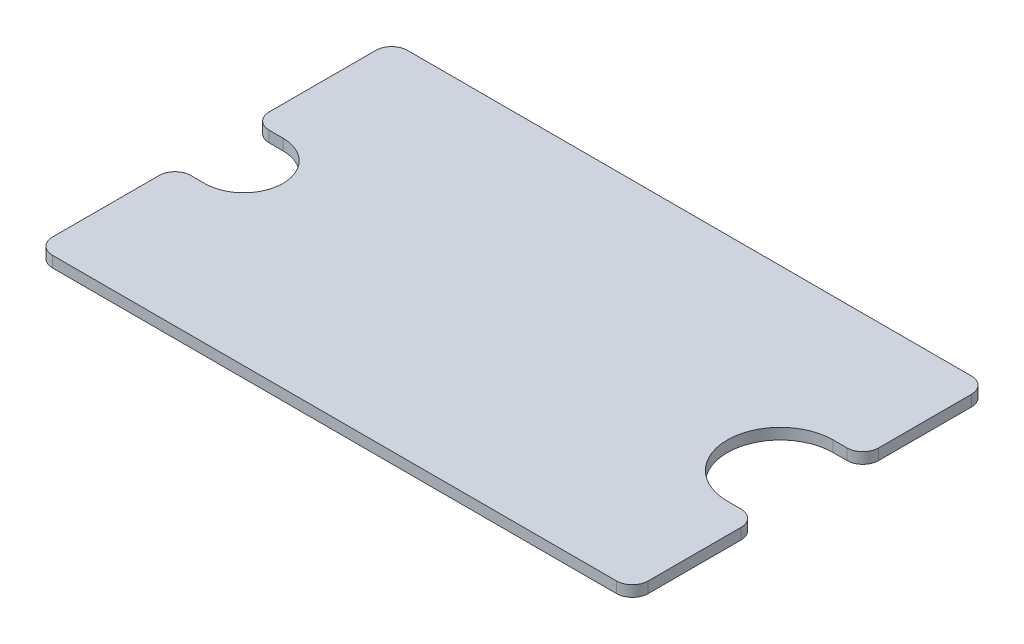
ISO-10303-21;
HEADER;
FILE_DESCRIPTION(('STEP AP214'),'2;1');
FILE_NAME('part.step','',(''),(''),'','','');
FILE_SCHEMA(('AUTOMOTIVE_DESIGN { 1 0 10303 214 1 1 1 1 }'));
ENDSEC;
DATA;
#1=APPLICATION_CONTEXT('core data for automotive mechanical design processes');
#2=APPLICATION_PROTOCOL_DEFINITION('international standard','automotive_design',2000,#1);
#3=PRODUCT_CONTEXT('',#1,'mechanical');
#4=PRODUCT('Part','Part','',(#3));
#5=PRODUCT_RELATED_PRODUCT_CATEGORY('part','',(#4));
#6=PRODUCT_DEFINITION_FORMATION('','',#4);
#7=PRODUCT_DEFINITION_CONTEXT('part definition',#1,'design');
#8=PRODUCT_DEFINITION('design','',#6,#7);
#9=PRODUCT_DEFINITION_SHAPE('','',#8);
#10=(LENGTH_UNIT() NAMED_UNIT(*) SI_UNIT(.MILLI.,.METRE.));
#11=(NAMED_UNIT(*) PLANE_ANGLE_UNIT() SI_UNIT($,.RADIAN.));
#12=(NAMED_UNIT(*) SI_UNIT($,.STERADIAN.) SOLID_ANGLE_UNIT());
#13=UNCERTAINTY_MEASURE_WITH_UNIT(LENGTH_MEASURE(1.E-05),#10,'distance_accuracy_value','');
#14=(GEOMETRIC_REPRESENTATION_CONTEXT(3) GLOBAL_UNCERTAINTY_ASSIGNED_CONTEXT((#13)) GLOBAL_UNIT_ASSIGNED_CONTEXT((#10,
#11,#12)) REPRESENTATION_CONTEXT('',''));
#15=CARTESIAN_POINT('',(0.,0.,0.));
#16=DIRECTION('',(0.,0.,1.));
#17=DIRECTION('',(1.,0.,0.));
#18=AXIS2_PLACEMENT_3D('',#15,#16,#17);
#19=CARTESIAN_POINT('',(6.49999999999997,7.6,-6.5));
#20=DIRECTION('',(0.,1.,0.));
#21=DIRECTION('',(0.,0.,1.));
#22=AXIS2_PLACEMENT_3D('',#19,#20,#21);
#23=PLANE('',#22);
#24=CARTESIAN_POINT('',(6.49999999999997,7.6,-6.5));
#25=DIRECTION('',(0.,1.,0.));
#26=DIRECTION('',(0.,0.,1.));
#27=AXIS2_PLACEMENT_3D('',#24,#25,#26);
#28=CIRCLE('',#27,2.3);
#29=CARTESIAN_POINT('',(4.19999999999997,7.6,-6.5));
#30=VERTEX_POINT('',#29);
#31=CARTESIAN_POINT('',(6.49999999999997,7.6,-4.2));
#32=VERTEX_POINT('',#31);
#33=EDGE_CURVE('E175',#30,#32,#28,.T.);
#34=ORIENTED_EDGE('',*,*,#33,.T.);
#35=DIRECTION('',(1.,0.,0.));
#36=VECTOR('',#35,1.);
#37=CARTESIAN_POINT('',(6.49999999999997,7.6,-4.2));
#38=LINE('',#37,#36);
#39=CARTESIAN_POINT('',(88.5,7.6,-4.2));
#40=VERTEX_POINT('',#39);
#41=EDGE_CURVE('E249',#32,#40,#38,.T.);
#42=ORIENTED_EDGE('',*,*,#41,.T.);
#43=CARTESIAN_POINT('',(88.5,7.6,-6.5));
#44=DIRECTION('',(0.,1.,0.));
#45=DIRECTION('',(0.,0.,1.));
#46=AXIS2_PLACEMENT_3D('',#43,#44,#45);
#47=CIRCLE('',#46,2.3);
#48=CARTESIAN_POINT('',(90.8,7.6,-6.5));
#49=VERTEX_POINT('',#48);
#50=EDGE_CURVE('E245',#40,#49,#47,.T.);
#51=ORIENTED_EDGE('',*,*,#50,.T.);
#52=DIRECTION('',(0.,0.,-1.));
#53=VECTOR('',#52,1.);
#54=CARTESIAN_POINT('',(90.8,7.6,-6.5));
#55=LINE('',#54,#53);
#56=CARTESIAN_POINT('',(90.8,7.6,-20.));
#57=VERTEX_POINT('',#56);
#58=EDGE_CURVE('E371',#49,#57,#55,.T.);
#59=ORIENTED_EDGE('',*,*,#58,.T.);
#60=CARTESIAN_POINT('',(88.5,7.6,-20.));
#61=DIRECTION('',(0.,1.,0.));
#62=DIRECTION('',(0.,0.,1.));
#63=AXIS2_PLACEMENT_3D('',#60,#61,#62);
#64=CIRCLE('',#63,2.3);
#65=CARTESIAN_POINT('',(88.5,7.6,-22.3));
#66=VERTEX_POINT('',#65);
#67=EDGE_CURVE('E367',#57,#66,#64,.T.);
#68=ORIENTED_EDGE('',*,*,#67,.T.);
#69=DIRECTION('',(-1.,0.,0.));
#70=VECTOR('',#69,1.);
#71=CARTESIAN_POINT('',(88.5,7.6,-22.3));
#72=LINE('',#71,#70);
#73=CARTESIAN_POINT('',(86.5,7.6,-22.3));
#74=VERTEX_POINT('',#73);
#75=EDGE_CURVE('E361',#66,#74,#72,.T.);
#76=ORIENTED_EDGE('',*,*,#75,.T.);
#77=CARTESIAN_POINT('',(86.5,7.6,-30.));
#78=DIRECTION('',(0.,-1.,0.));
#79=DIRECTION('',(0.,0.,1.));
#80=AXIS2_PLACEMENT_3D('',#77,#78,#79);
#81=CIRCLE('',#80,7.70000000000001);
#82=CARTESIAN_POINT('',(86.5,7.6,-37.7));
#83=VERTEX_POINT('',#82);
#84=EDGE_CURVE('E357',#74,#83,#81,.T.);
#85=ORIENTED_EDGE('',*,*,#84,.T.);
#86=DIRECTION('',(1.,0.,0.));
#87=VECTOR('',#86,1.);
#88=CARTESIAN_POINT('',(86.5,7.6,-37.7));
#89=LINE('',#88,#87);
#90=CARTESIAN_POINT('',(88.5,7.6,-37.7));
#91=VERTEX_POINT('',#90);
#92=EDGE_CURVE('E351',#83,#91,#89,.T.);
#93=ORIENTED_EDGE('',*,*,#92,.T.);
#94=CARTESIAN_POINT('',(88.5,7.6,-40.));
#95=DIRECTION('',(0.,1.,0.));
#96=DIRECTION('',(0.,0.,1.));
#97=AXIS2_PLACEMENT_3D('',#94,#95,#96);
#98=CIRCLE('',#97,2.3);
#99=CARTESIAN_POINT('',(90.8,7.6,-40.));
#100=VERTEX_POINT('',#99);
#101=EDGE_CURVE('E347',#91,#100,#98,.T.);
#102=ORIENTED_EDGE('',*,*,#101,.T.);
#103=DIRECTION('',(0.,0.,-1.));
#104=VECTOR('',#103,1.);
#105=CARTESIAN_POINT('',(90.8,7.6,-40.));
#106=LINE('',#105,#104);
#107=CARTESIAN_POINT('',(90.8,7.6,-53.5));
#108=VERTEX_POINT('',#107);
#109=EDGE_CURVE('E341',#100,#108,#106,.T.);
#110=ORIENTED_EDGE('',*,*,#109,.T.);
#111=CARTESIAN_POINT('',(88.5,7.6,-53.5));
#112=DIRECTION('',(0.,1.,0.));
#113=DIRECTION('',(0.,0.,1.));
#114=AXIS2_PLACEMENT_3D('',#111,#112,#113);
#115=CIRCLE('',#114,2.3);
#116=CARTESIAN_POINT('',(88.5,7.6,-55.8));
#117=VERTEX_POINT('',#116);
#118=EDGE_CURVE('E337',#108,#117,#115,.T.);
#119=ORIENTED_EDGE('',*,*,#118,.T.);
#120=DIRECTION('',(-1.,0.,0.));
#121=VECTOR('',#120,1.);
#122=CARTESIAN_POINT('',(88.5,7.6,-55.8));
#123=LINE('',#122,#121);
#124=CARTESIAN_POINT('',(6.50000000000001,7.6,-55.8));
#125=VERTEX_POINT('',#124);
#126=EDGE_CURVE('E331',#117,#125,#123,.T.);
#127=ORIENTED_EDGE('',*,*,#126,.T.);
#128=CARTESIAN_POINT('',(6.49999999999998,7.6,-53.5));
#129=DIRECTION('',(0.,1.,0.));
#130=DIRECTION('',(0.,0.,1.));
#131=AXIS2_PLACEMENT_3D('',#128,#129,#130);
#132=CIRCLE('',#131,2.3);
#133=CARTESIAN_POINT('',(4.19999999999998,7.6,-53.5));
#134=VERTEX_POINT('',#133);
#135=EDGE_CURVE('E327',#125,#134,#132,.T.);
#136=ORIENTED_EDGE('',*,*,#135,.T.);
#137=DIRECTION('',(0.,0.,1.));
#138=VECTOR('',#137,1.);
#139=CARTESIAN_POINT('',(4.19999999999998,7.6,-53.5));
#140=LINE('',#139,#138);
#141=CARTESIAN_POINT('',(4.19999999999997,7.6,-38.));
#142=VERTEX_POINT('',#141);
#143=EDGE_CURVE('E321',#134,#142,#140,.T.);
#144=ORIENTED_EDGE('',*,*,#143,.T.);
#145=CARTESIAN_POINT('',(6.49999999999997,7.6,-38.));
#146=DIRECTION('',(0.,1.,0.));
#147=DIRECTION('',(0.,0.,1.));
#148=AXIS2_PLACEMENT_3D('',#145,#146,#147);
#149=CIRCLE('',#148,2.3);
#150=CARTESIAN_POINT('',(6.49999999999997,7.6,-35.7));
#151=VERTEX_POINT('',#150);
#152=EDGE_CURVE('E317',#142,#151,#149,.T.);
#153=ORIENTED_EDGE('',*,*,#152,.T.);
#154=DIRECTION('',(1.,0.,0.));
#155=VECTOR('',#154,1.);
#156=CARTESIAN_POINT('',(6.49999999999997,7.6,-35.7));
#157=LINE('',#156,#155);
#158=CARTESIAN_POINT('',(8.5,7.6,-35.7));
#159=VERTEX_POINT('',#158);
#160=EDGE_CURVE('E311',#151,#159,#157,.T.);
#161=ORIENTED_EDGE('',*,*,#160,.T.);
#162=CARTESIAN_POINT('',(8.5,7.6,-30.));
#163=DIRECTION('',(0.,-1.,0.));
#164=DIRECTION('',(0.,0.,1.));
#165=AXIS2_PLACEMENT_3D('',#162,#163,#164);
#166=CIRCLE('',#165,5.7);
#167=CARTESIAN_POINT('',(8.5,7.6,-24.3));
#168=VERTEX_POINT('',#167);
#169=EDGE_CURVE('E307',#159,#168,#166,.T.);
#170=ORIENTED_EDGE('',*,*,#169,.T.);
#171=DIRECTION('',(-1.,0.,0.));
#172=VECTOR('',#171,1.);
#173=CARTESIAN_POINT('',(8.5,7.6,-24.3));
#174=LINE('',#173,#172);
#175=CARTESIAN_POINT('',(6.49999999999997,7.6,-24.3));
#176=VERTEX_POINT('',#175);
#177=EDGE_CURVE('E389',#168,#176,#174,.T.);
#178=ORIENTED_EDGE('',*,*,#177,.T.);
#179=CARTESIAN_POINT('',(6.49999999999997,7.6,-22.));
#180=DIRECTION('',(0.,1.,0.));
#181=DIRECTION('',(0.,0.,1.));
#182=AXIS2_PLACEMENT_3D('',#179,#180,#181);
#183=CIRCLE('',#182,2.3);
#184=CARTESIAN_POINT('',(4.19999999999997,7.6,-22.));
#185=VERTEX_POINT('',#184);
#186=EDGE_CURVE('E391',#176,#185,#183,.T.);
#187=ORIENTED_EDGE('',*,*,#186,.T.);
#188=DIRECTION('',(0.,0.,1.));
#189=VECTOR('',#188,1.);
#190=CARTESIAN_POINT('',(4.19999999999997,7.6,-22.));
#191=LINE('',#190,#189);
#192=EDGE_CURVE('E48',#185,#30,#191,.T.);
#193=ORIENTED_EDGE('',*,*,#192,.T.);
#194=EDGE_LOOP('',(#34,#42,#51,#59,#68,#76,#85,#93,#102,#110,#119,#127,#136,#144,#153,#161,#170,
#178,#187,#193));
#195=FACE_BOUND('',#194,.T.);
#196=ADVANCED_FACE('F32',(#195),#23,.T.);
#197=CARTESIAN_POINT('',(4.19999999999997,7.6,-22.));
#198=DIRECTION('',(1.,0.,0.));
#199=DIRECTION('',(0.,0.,-1.));
#200=AXIS2_PLACEMENT_3D('',#197,#198,#199);
#201=PLANE('',#200);
#202=DIRECTION('',(0.,0.,1.));
#203=VECTOR('',#202,1.);
#204=CARTESIAN_POINT('',(4.19999999999997,6.,-22.));
#205=LINE('',#204,#203);
#206=CARTESIAN_POINT('',(4.19999999999997,6.,-22.));
#207=VERTEX_POINT('',#206);
#208=CARTESIAN_POINT('',(4.19999999999997,6.,-6.5));
#209=VERTEX_POINT('',#208);
#210=EDGE_CURVE('E165',#207,#209,#205,.T.);
#211=ORIENTED_EDGE('',*,*,#210,.T.);
#212=DIRECTION('',(0.,-1.,0.));
#213=VECTOR('',#212,1.);
#214=CARTESIAN_POINT('',(4.19999999999997,7.6,-6.5));
#215=LINE('',#214,#213);
#216=EDGE_CURVE('E188',#30,#209,#215,.T.);
#217=ORIENTED_EDGE('',*,*,#216,.F.);
#218=ORIENTED_EDGE('',*,*,#192,.F.);
#219=DIRECTION('',(0.,-1.,0.));
#220=VECTOR('',#219,1.);
#221=CARTESIAN_POINT('',(4.19999999999997,7.6,-22.));
#222=LINE('',#221,#220);
#223=EDGE_CURVE('E182',#185,#207,#222,.T.);
#224=ORIENTED_EDGE('',*,*,#223,.T.);
#225=EDGE_LOOP('',(#211,#217,#218,#224));
#226=FACE_BOUND('',#225,.T.);
#227=ADVANCED_FACE('F187',(#226),#201,.F.);
#228=CARTESIAN_POINT('',(6.49999999999997,7.6,-22.));
#229=DIRECTION('',(0.,-1.,0.));
#230=DIRECTION('',(0.,0.,-1.));
#231=AXIS2_PLACEMENT_3D('',#228,#229,#230);
#232=CYLINDRICAL_SURFACE('',#231,2.3);
#233=CARTESIAN_POINT('',(6.49999999999997,6.,-22.));
#234=DIRECTION('',(0.,1.,0.));
#235=DIRECTION('',(0.,0.,1.));
#236=AXIS2_PLACEMENT_3D('',#233,#234,#235);
#237=CIRCLE('',#236,2.3);
#238=CARTESIAN_POINT('',(6.49999999999997,6.,-24.3));
#239=VERTEX_POINT('',#238);
#240=EDGE_CURVE('E168',#239,#207,#237,.T.);
#241=ORIENTED_EDGE('',*,*,#240,.T.);
#242=ORIENTED_EDGE('',*,*,#223,.F.);
#243=ORIENTED_EDGE('',*,*,#186,.F.);
#244=DIRECTION('',(0.,-1.,0.));
#245=VECTOR('',#244,1.);
#246=CARTESIAN_POINT('',(6.49999999999997,7.6,-24.3));
#247=LINE('',#246,#245);
#248=EDGE_CURVE('E184',#176,#239,#247,.T.);
#249=ORIENTED_EDGE('',*,*,#248,.T.);
#250=EDGE_LOOP('',(#241,#242,#243,#249));
#251=FACE_BOUND('',#250,.T.);
#252=ADVANCED_FACE('F180',(#251),#232,.T.);
#253=CARTESIAN_POINT('',(8.5,7.6,-24.3));
#254=DIRECTION('',(0.,0.,1.));
#255=DIRECTION('',(1.,0.,0.));
#256=AXIS2_PLACEMENT_3D('',#253,#254,#255);
#257=PLANE('',#256);
#258=DIRECTION('',(-1.,0.,0.));
#259=VECTOR('',#258,1.);
#260=CARTESIAN_POINT('',(8.5,6.,-24.3));
#261=LINE('',#260,#259);
#262=CARTESIAN_POINT('',(8.5,6.,-24.3));
#263=VERTEX_POINT('',#262);
#264=EDGE_CURVE('E185',#263,#239,#261,.T.);
#265=ORIENTED_EDGE('',*,*,#264,.T.);
#266=ORIENTED_EDGE('',*,*,#248,.F.);
#267=ORIENTED_EDGE('',*,*,#177,.F.);
#268=DIRECTION('',(0.,-1.,0.));
#269=VECTOR('',#268,1.);
#270=CARTESIAN_POINT('',(8.5,7.6,-24.3));
#271=LINE('',#270,#269);
#272=EDGE_CURVE('E190',#168,#263,#271,.T.);
#273=ORIENTED_EDGE('',*,*,#272,.T.);
#274=EDGE_LOOP('',(#265,#266,#267,#273));
#275=FACE_BOUND('',#274,.T.);
#276=ADVANCED_FACE('F300',(#275),#257,.F.);
#277=CARTESIAN_POINT('',(8.5,7.6,-30.));
#278=DIRECTION('',(0.,-1.,0.));
#279=DIRECTION('',(0.,0.,-1.));
#280=AXIS2_PLACEMENT_3D('',#277,#278,#279);
#281=CYLINDRICAL_SURFACE('',#280,5.7);
#282=CARTESIAN_POINT('',(8.5,6.,-30.));
#283=DIRECTION('',(0.,-1.,0.));
#284=DIRECTION('',(0.,0.,1.));
#285=AXIS2_PLACEMENT_3D('',#282,#283,#284);
#286=CIRCLE('',#285,5.7);
#287=CARTESIAN_POINT('',(8.5,6.,-35.7));
#288=VERTEX_POINT('',#287);
#289=EDGE_CURVE('E296',#288,#263,#286,.T.);
#290=ORIENTED_EDGE('',*,*,#289,.T.);
#291=ORIENTED_EDGE('',*,*,#272,.F.);
#292=ORIENTED_EDGE('',*,*,#169,.F.);
#293=DIRECTION('',(0.,-1.,0.));
#294=VECTOR('',#293,1.);
#295=CARTESIAN_POINT('',(8.5,7.6,-35.7));
#296=LINE('',#295,#294);
#297=EDGE_CURVE('E196',#159,#288,#296,.T.);
#298=ORIENTED_EDGE('',*,*,#297,.T.);
#299=EDGE_LOOP('',(#290,#291,#292,#298));
#300=FACE_BOUND('',#299,.T.);
#301=ADVANCED_FACE('F304',(#300),#281,.F.);
#302=CARTESIAN_POINT('',(6.49999999999997,7.6,-35.7));
#303=DIRECTION('',(0.,0.,-1.));
#304=DIRECTION('',(-1.,0.,0.));
#305=AXIS2_PLACEMENT_3D('',#302,#303,#304);
#306=PLANE('',#305);
#307=DIRECTION('',(1.,0.,0.));
#308=VECTOR('',#307,1.);
#309=CARTESIAN_POINT('',(6.49999999999997,6.,-35.7));
#310=LINE('',#309,#308);
#311=CARTESIAN_POINT('',(6.49999999999997,6.,-35.7));
#312=VERTEX_POINT('',#311);
#313=EDGE_CURVE('E293',#312,#288,#310,.T.);
#314=ORIENTED_EDGE('',*,*,#313,.T.);
#315=ORIENTED_EDGE('',*,*,#297,.F.);
#316=ORIENTED_EDGE('',*,*,#160,.F.);
#317=DIRECTION('',(0.,-1.,0.));
#318=VECTOR('',#317,1.);
#319=CARTESIAN_POINT('',(6.49999999999997,7.6,-35.7));
#320=LINE('',#319,#318);
#321=EDGE_CURVE('E199',#151,#312,#320,.T.);
#322=ORIENTED_EDGE('',*,*,#321,.T.);
#323=EDGE_LOOP('',(#314,#315,#316,#322));
#324=FACE_BOUND('',#323,.T.);
#325=ADVANCED_FACE('F310',(#324),#306,.F.);
#326=CARTESIAN_POINT('',(6.49999999999997,7.6,-38.));
#327=DIRECTION('',(0.,-1.,0.));
#328=DIRECTION('',(0.,0.,-1.));
#329=AXIS2_PLACEMENT_3D('',#326,#327,#328);
#330=CYLINDRICAL_SURFACE('',#329,2.3);
#331=CARTESIAN_POINT('',(6.49999999999997,6.,-38.));
#332=DIRECTION('',(0.,1.,0.));
#333=DIRECTION('',(0.,0.,1.));
#334=AXIS2_PLACEMENT_3D('',#331,#332,#333);
#335=CIRCLE('',#334,2.3);
#336=CARTESIAN_POINT('',(4.19999999999997,6.,-38.));
#337=VERTEX_POINT('',#336);
#338=EDGE_CURVE('E290',#337,#312,#335,.T.);
#339=ORIENTED_EDGE('',*,*,#338,.T.);
#340=ORIENTED_EDGE('',*,*,#321,.F.);
#341=ORIENTED_EDGE('',*,*,#152,.F.);
#342=DIRECTION('',(0.,-1.,0.));
#343=VECTOR('',#342,1.);
#344=CARTESIAN_POINT('',(4.19999999999997,7.6,-38.));
#345=LINE('',#344,#343);
#346=EDGE_CURVE('E202',#142,#337,#345,.T.);
#347=ORIENTED_EDGE('',*,*,#346,.T.);
#348=EDGE_LOOP('',(#339,#340,#341,#347));
#349=FACE_BOUND('',#348,.T.);
#350=ADVANCED_FACE('F314',(#349),#330,.T.);
#351=CARTESIAN_POINT('',(4.19999999999998,7.6,-53.5));
#352=DIRECTION('',(1.,0.,0.));
#353=DIRECTION('',(0.,0.,-1.));
#354=AXIS2_PLACEMENT_3D('',#351,#352,#353);
#355=PLANE('',#354);
#356=DIRECTION('',(0.,0.,1.));
#357=VECTOR('',#356,1.);
#358=CARTESIAN_POINT('',(4.19999999999998,6.,-53.5));
#359=LINE('',#358,#357);
#360=CARTESIAN_POINT('',(4.19999999999998,6.,-53.5));
#361=VERTEX_POINT('',#360);
#362=EDGE_CURVE('E287',#361,#337,#359,.T.);
#363=ORIENTED_EDGE('',*,*,#362,.T.);
#364=ORIENTED_EDGE('',*,*,#346,.F.);
#365=ORIENTED_EDGE('',*,*,#143,.F.);
#366=DIRECTION('',(0.,-1.,0.));
#367=VECTOR('',#366,1.);
#368=CARTESIAN_POINT('',(4.19999999999998,7.6,-53.5));
#369=LINE('',#368,#367);
#370=EDGE_CURVE('E205',#134,#361,#369,.T.);
#371=ORIENTED_EDGE('',*,*,#370,.T.);
#372=EDGE_LOOP('',(#363,#364,#365,#371));
#373=FACE_BOUND('',#372,.T.);
#374=ADVANCED_FACE('F320',(#373),#355,.F.);
#375=CARTESIAN_POINT('',(6.49999999999998,7.6,-53.5));
#376=DIRECTION('',(0.,-1.,0.));
#377=DIRECTION('',(0.,0.,-1.));
#378=AXIS2_PLACEMENT_3D('',#375,#376,#377);
#379=CYLINDRICAL_SURFACE('',#378,2.3);
#380=CARTESIAN_POINT('',(6.49999999999998,6.,-53.5));
#381=DIRECTION('',(0.,1.,0.));
#382=DIRECTION('',(0.,0.,1.));
#383=AXIS2_PLACEMENT_3D('',#380,#381,#382);
#384=CIRCLE('',#383,2.3);
#385=CARTESIAN_POINT('',(6.49999999999998,6.,-55.8));
#386=VERTEX_POINT('',#385);
#387=EDGE_CURVE('E284',#386,#361,#384,.T.);
#388=ORIENTED_EDGE('',*,*,#387,.T.);
#389=ORIENTED_EDGE('',*,*,#370,.F.);
#390=ORIENTED_EDGE('',*,*,#135,.F.);
#391=DIRECTION('',(0.,-1.,0.));
#392=VECTOR('',#391,1.);
#393=CARTESIAN_POINT('',(6.50000000000001,7.6,-55.8));
#394=LINE('',#393,#392);
#395=EDGE_CURVE('E208',#125,#386,#394,.T.);
#396=ORIENTED_EDGE('',*,*,#395,.T.);
#397=EDGE_LOOP('',(#388,#389,#390,#396));
#398=FACE_BOUND('',#397,.T.);
#399=ADVANCED_FACE('F324',(#398),#379,.T.);
#400=CARTESIAN_POINT('',(88.5,7.6,-55.8));
#401=DIRECTION('',(0.,0.,1.));
#402=DIRECTION('',(1.,0.,0.));
#403=AXIS2_PLACEMENT_3D('',#400,#401,#402);
#404=PLANE('',#403);
#405=DIRECTION('',(-1.,0.,0.));
#406=VECTOR('',#405,1.);
#407=CARTESIAN_POINT('',(88.5,6.,-55.8));
#408=LINE('',#407,#406);
#409=CARTESIAN_POINT('',(88.5,6.,-55.8));
#410=VERTEX_POINT('',#409);
#411=EDGE_CURVE('E281',#410,#386,#408,.T.);
#412=ORIENTED_EDGE('',*,*,#411,.T.);
#413=ORIENTED_EDGE('',*,*,#395,.F.);
#414=ORIENTED_EDGE('',*,*,#126,.F.);
#415=DIRECTION('',(0.,-1.,0.));
#416=VECTOR('',#415,1.);
#417=CARTESIAN_POINT('',(88.5,7.6,-55.8));
#418=LINE('',#417,#416);
#419=EDGE_CURVE('E211',#117,#410,#418,.T.);
#420=ORIENTED_EDGE('',*,*,#419,.T.);
#421=EDGE_LOOP('',(#412,#413,#414,#420));
#422=FACE_BOUND('',#421,.T.);
#423=ADVANCED_FACE('F330',(#422),#404,.F.);
#424=CARTESIAN_POINT('',(88.5,7.6,-53.5));
#425=DIRECTION('',(0.,-1.,0.));
#426=DIRECTION('',(0.,0.,-1.));
#427=AXIS2_PLACEMENT_3D('',#424,#425,#426);
#428=CYLINDRICAL_SURFACE('',#427,2.3);
#429=CARTESIAN_POINT('',(88.5,6.,-53.5));
#430=DIRECTION('',(0.,1.,0.));
#431=DIRECTION('',(0.,0.,1.));
#432=AXIS2_PLACEMENT_3D('',#429,#430,#431);
#433=CIRCLE('',#432,2.3);
#434=CARTESIAN_POINT('',(90.8,6.,-53.5));
#435=VERTEX_POINT('',#434);
#436=EDGE_CURVE('E278',#435,#410,#433,.T.);
#437=ORIENTED_EDGE('',*,*,#436,.T.);
#438=ORIENTED_EDGE('',*,*,#419,.F.);
#439=ORIENTED_EDGE('',*,*,#118,.F.);
#440=DIRECTION('',(0.,-1.,0.));
#441=VECTOR('',#440,1.);
#442=CARTESIAN_POINT('',(90.8,7.6,-53.5));
#443=LINE('',#442,#441);
#444=EDGE_CURVE('E214',#108,#435,#443,.T.);
#445=ORIENTED_EDGE('',*,*,#444,.T.);
#446=EDGE_LOOP('',(#437,#438,#439,#445));
#447=FACE_BOUND('',#446,.T.);
#448=ADVANCED_FACE('F334',(#447),#428,.T.);
#449=CARTESIAN_POINT('',(90.8,7.6,-40.));
#450=DIRECTION('',(-1.,0.,0.));
#451=DIRECTION('',(0.,0.,1.));
#452=AXIS2_PLACEMENT_3D('',#449,#450,#451);
#453=PLANE('',#452);
#454=DIRECTION('',(0.,0.,-1.));
#455=VECTOR('',#454,1.);
#456=CARTESIAN_POINT('',(90.8,6.,-40.));
#457=LINE('',#456,#455);
#458=CARTESIAN_POINT('',(90.8,6.,-40.));
#459=VERTEX_POINT('',#458);
#460=EDGE_CURVE('E275',#459,#435,#457,.T.);
#461=ORIENTED_EDGE('',*,*,#460,.T.);
#462=ORIENTED_EDGE('',*,*,#444,.F.);
#463=ORIENTED_EDGE('',*,*,#109,.F.);
#464=DIRECTION('',(0.,-1.,0.));
#465=VECTOR('',#464,1.);
#466=CARTESIAN_POINT('',(90.8,7.6,-40.));
#467=LINE('',#466,#465);
#468=EDGE_CURVE('E217',#100,#459,#467,.T.);
#469=ORIENTED_EDGE('',*,*,#468,.T.);
#470=EDGE_LOOP('',(#461,#462,#463,#469));
#471=FACE_BOUND('',#470,.T.);
#472=ADVANCED_FACE('F340',(#471),#453,.F.);
#473=CARTESIAN_POINT('',(88.5,7.6,-40.));
#474=DIRECTION('',(0.,-1.,0.));
#475=DIRECTION('',(0.,0.,-1.));
#476=AXIS2_PLACEMENT_3D('',#473,#474,#475);
#477=CYLINDRICAL_SURFACE('',#476,2.3);
#478=CARTESIAN_POINT('',(88.5,6.,-40.));
#479=DIRECTION('',(0.,1.,0.));
#480=DIRECTION('',(0.,0.,1.));
#481=AXIS2_PLACEMENT_3D('',#478,#479,#480);
#482=CIRCLE('',#481,2.3);
#483=CARTESIAN_POINT('',(88.5,6.,-37.7));
#484=VERTEX_POINT('',#483);
#485=EDGE_CURVE('E272',#484,#459,#482,.T.);
#486=ORIENTED_EDGE('',*,*,#485,.T.);
#487=ORIENTED_EDGE('',*,*,#468,.F.);
#488=ORIENTED_EDGE('',*,*,#101,.F.);
#489=DIRECTION('',(0.,-1.,0.));
#490=VECTOR('',#489,1.);
#491=CARTESIAN_POINT('',(88.5,7.6,-37.7));
#492=LINE('',#491,#490);
#493=EDGE_CURVE('E220',#91,#484,#492,.T.);
#494=ORIENTED_EDGE('',*,*,#493,.T.);
#495=EDGE_LOOP('',(#486,#487,#488,#494));
#496=FACE_BOUND('',#495,.T.);
#497=ADVANCED_FACE('F344',(#496),#477,.T.);
#498=CARTESIAN_POINT('',(86.5,7.6,-37.7));
#499=DIRECTION('',(0.,0.,-1.));
#500=DIRECTION('',(-1.,0.,0.));
#501=AXIS2_PLACEMENT_3D('',#498,#499,#500);
#502=PLANE('',#501);
#503=DIRECTION('',(1.,0.,0.));
#504=VECTOR('',#503,1.);
#505=CARTESIAN_POINT('',(86.5,6.,-37.7));
#506=LINE('',#505,#504);
#507=CARTESIAN_POINT('',(86.5,6.,-37.7));
#508=VERTEX_POINT('',#507);
#509=EDGE_CURVE('E269',#508,#484,#506,.T.);
#510=ORIENTED_EDGE('',*,*,#509,.T.);
#511=ORIENTED_EDGE('',*,*,#493,.F.);
#512=ORIENTED_EDGE('',*,*,#92,.F.);
#513=DIRECTION('',(0.,-1.,0.));
#514=VECTOR('',#513,1.);
#515=CARTESIAN_POINT('',(86.5,7.6,-37.7));
#516=LINE('',#515,#514);
#517=EDGE_CURVE('E223',#83,#508,#516,.T.);
#518=ORIENTED_EDGE('',*,*,#517,.T.);
#519=EDGE_LOOP('',(#510,#511,#512,#518));
#520=FACE_BOUND('',#519,.T.);
#521=ADVANCED_FACE('F350',(#520),#502,.F.);
#522=CARTESIAN_POINT('',(86.5,7.6,-30.));
#523=DIRECTION('',(0.,-1.,0.));
#524=DIRECTION('',(0.,0.,-1.));
#525=AXIS2_PLACEMENT_3D('',#522,#523,#524);
#526=CYLINDRICAL_SURFACE('',#525,7.70000000000001);
#527=CARTESIAN_POINT('',(86.5,6.,-30.));
#528=DIRECTION('',(0.,-1.,0.));
#529=DIRECTION('',(0.,0.,1.));
#530=AXIS2_PLACEMENT_3D('',#527,#528,#529);
#531=CIRCLE('',#530,7.70000000000001);
#532=CARTESIAN_POINT('',(86.5,6.,-22.3));
#533=VERTEX_POINT('',#532);
#534=EDGE_CURVE('E266',#533,#508,#531,.T.);
#535=ORIENTED_EDGE('',*,*,#534,.T.);
#536=ORIENTED_EDGE('',*,*,#517,.F.);
#537=ORIENTED_EDGE('',*,*,#84,.F.);
#538=DIRECTION('',(0.,-1.,0.));
#539=VECTOR('',#538,1.);
#540=CARTESIAN_POINT('',(86.5,7.6,-22.3));
#541=LINE('',#540,#539);
#542=EDGE_CURVE('E226',#74,#533,#541,.T.);
#543=ORIENTED_EDGE('',*,*,#542,.T.);
#544=EDGE_LOOP('',(#535,#536,#537,#543));
#545=FACE_BOUND('',#544,.T.);
#546=ADVANCED_FACE('F354',(#545),#526,.F.);
#547=CARTESIAN_POINT('',(88.5,7.6,-22.3));
#548=DIRECTION('',(0.,0.,1.));
#549=DIRECTION('',(1.,0.,0.));
#550=AXIS2_PLACEMENT_3D('',#547,#548,#549);
#551=PLANE('',#550);
#552=DIRECTION('',(-1.,0.,0.));
#553=VECTOR('',#552,1.);
#554=CARTESIAN_POINT('',(88.5,6.,-22.3));
#555=LINE('',#554,#553);
#556=CARTESIAN_POINT('',(88.5,6.,-22.3));
#557=VERTEX_POINT('',#556);
#558=EDGE_CURVE('E263',#557,#533,#555,.T.);
#559=ORIENTED_EDGE('',*,*,#558,.T.);
#560=ORIENTED_EDGE('',*,*,#542,.F.);
#561=ORIENTED_EDGE('',*,*,#75,.F.);
#562=DIRECTION('',(0.,-1.,0.));
#563=VECTOR('',#562,1.);
#564=CARTESIAN_POINT('',(88.5,7.6,-22.3));
#565=LINE('',#564,#563);
#566=EDGE_CURVE('E229',#66,#557,#565,.T.);
#567=ORIENTED_EDGE('',*,*,#566,.T.);
#568=EDGE_LOOP('',(#559,#560,#561,#567));
#569=FACE_BOUND('',#568,.T.);
#570=ADVANCED_FACE('F360',(#569),#551,.F.);
#571=CARTESIAN_POINT('',(88.5,7.6,-20.));
#572=DIRECTION('',(0.,-1.,0.));
#573=DIRECTION('',(0.,0.,-1.));
#574=AXIS2_PLACEMENT_3D('',#571,#572,#573);
#575=CYLINDRICAL_SURFACE('',#574,2.3);
#576=CARTESIAN_POINT('',(88.5,6.,-20.));
#577=DIRECTION('',(0.,1.,0.));
#578=DIRECTION('',(0.,0.,1.));
#579=AXIS2_PLACEMENT_3D('',#576,#577,#578);
#580=CIRCLE('',#579,2.3);
#581=CARTESIAN_POINT('',(90.8,6.,-20.));
#582=VERTEX_POINT('',#581);
#583=EDGE_CURVE('E260',#582,#557,#580,.T.);
#584=ORIENTED_EDGE('',*,*,#583,.T.);
#585=ORIENTED_EDGE('',*,*,#566,.F.);
#586=ORIENTED_EDGE('',*,*,#67,.F.);
#587=DIRECTION('',(0.,-1.,0.));
#588=VECTOR('',#587,1.);
#589=CARTESIAN_POINT('',(90.8,7.6,-20.));
#590=LINE('',#589,#588);
#591=EDGE_CURVE('E232',#57,#582,#590,.T.);
#592=ORIENTED_EDGE('',*,*,#591,.T.);
#593=EDGE_LOOP('',(#584,#585,#586,#592));
#594=FACE_BOUND('',#593,.T.);
#595=ADVANCED_FACE('F364',(#594),#575,.T.);
#596=CARTESIAN_POINT('',(90.8,7.6,-6.5));
#597=DIRECTION('',(-1.,0.,0.));
#598=DIRECTION('',(0.,0.,1.));
#599=AXIS2_PLACEMENT_3D('',#596,#597,#598);
#600=PLANE('',#599);
#601=DIRECTION('',(0.,0.,-1.));
#602=VECTOR('',#601,1.);
#603=CARTESIAN_POINT('',(90.8,6.,-6.5));
#604=LINE('',#603,#602);
#605=CARTESIAN_POINT('',(90.8,6.,-6.5));
#606=VERTEX_POINT('',#605);
#607=EDGE_CURVE('E253',#606,#582,#604,.T.);
#608=ORIENTED_EDGE('',*,*,#607,.T.);
#609=ORIENTED_EDGE('',*,*,#591,.F.);
#610=ORIENTED_EDGE('',*,*,#58,.F.);
#611=DIRECTION('',(0.,-1.,0.));
#612=VECTOR('',#611,1.);
#613=CARTESIAN_POINT('',(90.8,7.6,-6.5));
#614=LINE('',#613,#612);
#615=EDGE_CURVE('E235',#49,#606,#614,.T.);
#616=ORIENTED_EDGE('',*,*,#615,.T.);
#617=EDGE_LOOP('',(#608,#609,#610,#616));
#618=FACE_BOUND('',#617,.T.);
#619=ADVANCED_FACE('F370',(#618),#600,.F.);
#620=CARTESIAN_POINT('',(88.5,7.6,-6.5));
#621=DIRECTION('',(0.,-1.,0.));
#622=DIRECTION('',(0.,0.,-1.));
#623=AXIS2_PLACEMENT_3D('',#620,#621,#622);
#624=CYLINDRICAL_SURFACE('',#623,2.3);
#625=CARTESIAN_POINT('',(88.5,6.,-6.5));
#626=DIRECTION('',(0.,1.,0.));
#627=DIRECTION('',(0.,0.,1.));
#628=AXIS2_PLACEMENT_3D('',#625,#626,#627);
#629=CIRCLE('',#628,2.3);
#630=CARTESIAN_POINT('',(88.5,6.,-4.2));
#631=VERTEX_POINT('',#630);
#632=EDGE_CURVE('E244',#631,#606,#629,.T.);
#633=ORIENTED_EDGE('',*,*,#632,.T.);
#634=ORIENTED_EDGE('',*,*,#615,.F.);
#635=ORIENTED_EDGE('',*,*,#50,.F.);
#636=DIRECTION('',(0.,-1.,0.));
#637=VECTOR('',#636,1.);
#638=CARTESIAN_POINT('',(88.5,7.6,-4.2));
#639=LINE('',#638,#637);
#640=EDGE_CURVE('E41',#40,#631,#639,.T.);
#641=ORIENTED_EDGE('',*,*,#640,.T.);
#642=EDGE_LOOP('',(#633,#634,#635,#641));
#643=FACE_BOUND('',#642,.T.);
#644=ADVANCED_FACE('F242',(#643),#624,.T.);
#645=CARTESIAN_POINT('',(6.49999999999997,7.6,-4.2));
#646=DIRECTION('',(0.,0.,-1.));
#647=DIRECTION('',(-1.,0.,0.));
#648=AXIS2_PLACEMENT_3D('',#645,#646,#647);
#649=PLANE('',#648);
#650=DIRECTION('',(1.,0.,0.));
#651=VECTOR('',#650,1.);
#652=CARTESIAN_POINT('',(6.49999999999997,6.,-4.2));
#653=LINE('',#652,#651);
#654=CARTESIAN_POINT('',(6.49999999999997,6.,-4.2));
#655=VERTEX_POINT('',#654);
#656=EDGE_CURVE('E250',#655,#631,#653,.T.);
#657=ORIENTED_EDGE('',*,*,#656,.T.);
#658=ORIENTED_EDGE('',*,*,#640,.F.);
#659=ORIENTED_EDGE('',*,*,#41,.F.);
#660=DIRECTION('',(0.,-1.,0.));
#661=VECTOR('',#660,1.);
#662=CARTESIAN_POINT('',(6.49999999999997,7.6,-4.2));
#663=LINE('',#662,#661);
#664=EDGE_CURVE('E11',#32,#655,#663,.T.);
#665=ORIENTED_EDGE('',*,*,#664,.T.);
#666=EDGE_LOOP('',(#657,#658,#659,#665));
#667=FACE_BOUND('',#666,.T.);
#668=ADVANCED_FACE('F248',(#667),#649,.F.);
#669=CARTESIAN_POINT('',(6.49999999999997,7.6,-6.5));
#670=DIRECTION('',(0.,-1.,0.));
#671=DIRECTION('',(0.,0.,-1.));
#672=AXIS2_PLACEMENT_3D('',#669,#670,#671);
#673=CYLINDRICAL_SURFACE('',#672,2.3);
#674=CARTESIAN_POINT('',(6.49999999999997,6.,-6.5));
#675=DIRECTION('',(0.,1.,0.));
#676=DIRECTION('',(0.,0.,1.));
#677=AXIS2_PLACEMENT_3D('',#674,#675,#676);
#678=CIRCLE('',#677,2.3);
#679=EDGE_CURVE('E171',#209,#655,#678,.T.);
#680=ORIENTED_EDGE('',*,*,#679,.T.);
#681=ORIENTED_EDGE('',*,*,#664,.F.);
#682=ORIENTED_EDGE('',*,*,#33,.F.);
#683=ORIENTED_EDGE('',*,*,#216,.T.);
#684=EDGE_LOOP('',(#680,#681,#682,#683));
#685=FACE_BOUND('',#684,.T.);
#686=ADVANCED_FACE('F34',(#685),#673,.T.);
#687=CARTESIAN_POINT('',(6.49999999999997,6.,-6.5));
#688=DIRECTION('',(0.,1.,0.));
#689=DIRECTION('',(0.,0.,1.));
#690=AXIS2_PLACEMENT_3D('',#687,#688,#689);
#691=PLANE('',#690);
#692=ORIENTED_EDGE('',*,*,#210,.F.);
#693=ORIENTED_EDGE('',*,*,#240,.F.);
#694=ORIENTED_EDGE('',*,*,#264,.F.);
#695=ORIENTED_EDGE('',*,*,#289,.F.);
#696=ORIENTED_EDGE('',*,*,#313,.F.);
#697=ORIENTED_EDGE('',*,*,#338,.F.);
#698=ORIENTED_EDGE('',*,*,#362,.F.);
#699=ORIENTED_EDGE('',*,*,#387,.F.);
#700=ORIENTED_EDGE('',*,*,#411,.F.);
#701=ORIENTED_EDGE('',*,*,#436,.F.);
#702=ORIENTED_EDGE('',*,*,#460,.F.);
#703=ORIENTED_EDGE('',*,*,#485,.F.);
#704=ORIENTED_EDGE('',*,*,#509,.F.);
#705=ORIENTED_EDGE('',*,*,#534,.F.);
#706=ORIENTED_EDGE('',*,*,#558,.F.);
#707=ORIENTED_EDGE('',*,*,#583,.F.);
#708=ORIENTED_EDGE('',*,*,#607,.F.);
#709=ORIENTED_EDGE('',*,*,#632,.F.);
#710=ORIENTED_EDGE('',*,*,#656,.F.);
#711=ORIENTED_EDGE('',*,*,#679,.F.);
#712=EDGE_LOOP('',(#692,#693,#694,#695,#696,#697,#698,#699,#700,#701,#702,#703,#704,#705,#706,
#707,#708,#709,#710,#711));
#713=FACE_BOUND('',#712,.T.);
#714=ADVANCED_FACE('F167',(#713),#691,.F.);
#715=CLOSED_SHELL('',(#196,#227,#252,#276,#301,#325,#350,#374,#399,#423,#448,#472,#497,#521,
#546,#570,#595,#619,#644,#668,#686,#714));
#716=MANIFOLD_SOLID_BREP('B2',#715);
#717=ADVANCED_BREP_SHAPE_REPRESENTATION('',(#18,#716),#14);
#718=SHAPE_DEFINITION_REPRESENTATION(#9,#717);
ENDSEC;
END-ISO-10303-21;
